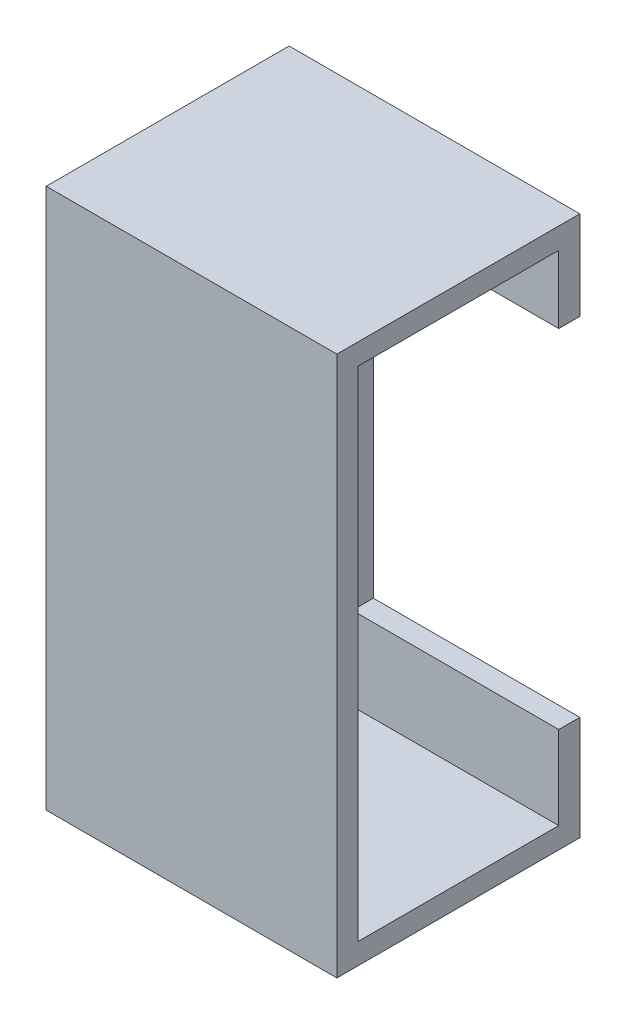
ISO-10303-21;
HEADER;
FILE_DESCRIPTION(('STEP AP214'),'2;1');
FILE_NAME('part.step','',(''),(''),'','','');
FILE_SCHEMA(('AUTOMOTIVE_DESIGN { 1 0 10303 214 1 1 1 1 }'));
ENDSEC;
DATA;
#1=APPLICATION_CONTEXT('core data for automotive mechanical design processes');
#2=APPLICATION_PROTOCOL_DEFINITION('international standard','automotive_design',2000,#1);
#3=PRODUCT_CONTEXT('',#1,'mechanical');
#4=PRODUCT('Part','Part','',(#3));
#5=PRODUCT_RELATED_PRODUCT_CATEGORY('part','',(#4));
#6=PRODUCT_DEFINITION_FORMATION('','',#4);
#7=PRODUCT_DEFINITION_CONTEXT('part definition',#1,'design');
#8=PRODUCT_DEFINITION('design','',#6,#7);
#9=PRODUCT_DEFINITION_SHAPE('','',#8);
#10=(LENGTH_UNIT() NAMED_UNIT(*) SI_UNIT(.MILLI.,.METRE.));
#11=(NAMED_UNIT(*) PLANE_ANGLE_UNIT() SI_UNIT($,.RADIAN.));
#12=(NAMED_UNIT(*) SI_UNIT($,.STERADIAN.) SOLID_ANGLE_UNIT());
#13=UNCERTAINTY_MEASURE_WITH_UNIT(LENGTH_MEASURE(1.E-05),#10,'distance_accuracy_value','');
#14=(GEOMETRIC_REPRESENTATION_CONTEXT(3) GLOBAL_UNCERTAINTY_ASSIGNED_CONTEXT((#13)) GLOBAL_UNIT_ASSIGNED_CONTEXT((#10,
#11,#12)) REPRESENTATION_CONTEXT('',''));
#15=CARTESIAN_POINT('',(0.,0.,0.));
#16=DIRECTION('',(0.,0.,1.));
#17=DIRECTION('',(1.,0.,0.));
#18=AXIS2_PLACEMENT_3D('',#15,#16,#17);
#19=CARTESIAN_POINT('',(-1.09634523681734E-13,94.3783526673284,50.2626326175547));
#20=DIRECTION('',(1.,0.,0.));
#21=DIRECTION('',(0.,0.,1.));
#22=AXIS2_PLACEMENT_3D('',#19,#20,#21);
#23=PLANE('',#22);
#24=DIRECTION('',(0.,1.,0.));
#25=VECTOR('',#24,1.);
#26=CARTESIAN_POINT('',(-1.08524300657109E-13,87.9658533658496,47.3796326175547));
#27=LINE('',#26,#25);
#28=CARTESIAN_POINT('',(-1.08524300657109E-13,87.9658533658496,47.3796326175547));
#29=VERTEX_POINT('',#28);
#30=CARTESIAN_POINT('',(-1.08524300657109E-13,100.790851968807,47.3796326175547));
#31=VERTEX_POINT('',#30);
#32=EDGE_CURVE('E265',#29,#31,#27,.T.);
#33=ORIENTED_EDGE('',*,*,#32,.F.);
#34=DIRECTION('',(0.,0.,-1.));
#35=VECTOR('',#34,1.);
#36=CARTESIAN_POINT('',(-1.14075415780235E-13,87.9658533658496,53.1456326175547));
#37=LINE('',#36,#35);
#38=CARTESIAN_POINT('',(-1.14075415780235E-13,87.9658533658496,53.1456326175547));
#39=VERTEX_POINT('',#38);
#40=EDGE_CURVE('E204',#39,#29,#37,.T.);
#41=ORIENTED_EDGE('',*,*,#40,.F.);
#42=DIRECTION('',(0.,-1.,0.));
#43=VECTOR('',#42,1.);
#44=CARTESIAN_POINT('',(-1.16295861829485E-13,100.790851968807,53.1456326175547));
#45=LINE('',#44,#43);
#46=CARTESIAN_POINT('',(-1.16295861829485E-13,100.790851968807,53.1456326175547));
#47=VERTEX_POINT('',#46);
#48=EDGE_CURVE('E11',#47,#39,#45,.T.);
#49=ORIENTED_EDGE('',*,*,#48,.F.);
#50=DIRECTION('',(0.,0.,1.));
#51=VECTOR('',#50,1.);
#52=CARTESIAN_POINT('',(-1.08524300657109E-13,100.790851968807,47.3796326175547));
#53=LINE('',#52,#51);
#54=EDGE_CURVE('E182',#31,#47,#53,.T.);
#55=ORIENTED_EDGE('',*,*,#54,.F.);
#56=EDGE_LOOP('',(#33,#41,#49,#55));
#57=FACE_BOUND('',#56,.T.);
#58=ADVANCED_FACE('F16',(#57),#23,.F.);
#59=CARTESIAN_POINT('',(6.89999999999989,94.3783526673284,50.2626326175547));
#60=DIRECTION('',(1.,0.,0.));
#61=DIRECTION('',(0.,0.,1.));
#62=AXIS2_PLACEMENT_3D('',#59,#60,#61);
#63=PLANE('',#62);
#64=DIRECTION('',(0.,1.,0.));
#65=VECTOR('',#64,1.);
#66=CARTESIAN_POINT('',(6.89999999999989,87.9658533658496,47.3796326175547));
#67=LINE('',#66,#65);
#68=CARTESIAN_POINT('',(6.89999999999989,98.681771929591,47.3796326175547));
#69=VERTEX_POINT('',#68);
#70=CARTESIAN_POINT('',(6.89999999999989,100.790851968807,47.3796326175547));
#71=VERTEX_POINT('',#70);
#72=EDGE_CURVE('E165',#69,#71,#67,.T.);
#73=ORIENTED_EDGE('',*,*,#72,.T.);
#74=DIRECTION('',(0.,0.,1.));
#75=VECTOR('',#74,1.);
#76=CARTESIAN_POINT('',(6.89999999999989,100.790851968807,47.3796326175547));
#77=LINE('',#76,#75);
#78=CARTESIAN_POINT('',(6.89999999999988,100.790851968807,53.1456326175547));
#79=VERTEX_POINT('',#78);
#80=EDGE_CURVE('E179',#71,#79,#77,.T.);
#81=ORIENTED_EDGE('',*,*,#80,.T.);
#82=DIRECTION('',(0.,-1.,0.));
#83=VECTOR('',#82,1.);
#84=CARTESIAN_POINT('',(6.89999999999988,100.790851968807,53.1456326175547));
#85=LINE('',#84,#83);
#86=CARTESIAN_POINT('',(6.89999999999988,87.9658533658496,53.1456326175547));
#87=VERTEX_POINT('',#86);
#88=EDGE_CURVE('E26',#79,#87,#85,.T.);
#89=ORIENTED_EDGE('',*,*,#88,.T.);
#90=DIRECTION('',(0.,0.,-1.));
#91=VECTOR('',#90,1.);
#92=CARTESIAN_POINT('',(6.89999999999988,87.9658533658496,53.1456326175547));
#93=LINE('',#92,#91);
#94=CARTESIAN_POINT('',(6.89999999999989,87.9658533658496,47.3796326175547));
#95=VERTEX_POINT('',#94);
#96=EDGE_CURVE('E173',#87,#95,#93,.T.);
#97=ORIENTED_EDGE('',*,*,#96,.T.);
#98=DIRECTION('',(0.,1.,0.));
#99=VECTOR('',#98,1.);
#100=CARTESIAN_POINT('',(6.89999999999989,87.9658533658496,47.3796326175547));
#101=LINE('',#100,#99);
#102=CARTESIAN_POINT('',(6.89999999999989,90.4404594516183,47.3796326175547));
#103=VERTEX_POINT('',#102);
#104=EDGE_CURVE('E152',#95,#103,#101,.T.);
#105=ORIENTED_EDGE('',*,*,#104,.T.);
#106=DIRECTION('',(0.,0.,1.));
#107=VECTOR('',#106,1.);
#108=CARTESIAN_POINT('',(6.89999999999989,90.4404594516183,47.8796326175547));
#109=LINE('',#108,#107);
#110=CARTESIAN_POINT('',(6.89999999999989,90.4404594516183,47.8796326175547));
#111=VERTEX_POINT('',#110);
#112=EDGE_CURVE('E147',#103,#111,#109,.T.);
#113=ORIENTED_EDGE('',*,*,#112,.T.);
#114=DIRECTION('',(0.,-1.,0.));
#115=VECTOR('',#114,1.);
#116=CARTESIAN_POINT('',(6.89999999999989,88.4658533658496,47.8796326175547));
#117=LINE('',#116,#115);
#118=CARTESIAN_POINT('',(6.89999999999989,88.4658533658496,47.8796326175547));
#119=VERTEX_POINT('',#118);
#120=EDGE_CURVE('E224',#111,#119,#117,.T.);
#121=ORIENTED_EDGE('',*,*,#120,.T.);
#122=DIRECTION('',(0.,0.,1.));
#123=VECTOR('',#122,1.);
#124=CARTESIAN_POINT('',(6.89999999999989,88.4658533658496,52.6456326175547));
#125=LINE('',#124,#123);
#126=CARTESIAN_POINT('',(6.89999999999989,88.4658533658496,52.6456326175547));
#127=VERTEX_POINT('',#126);
#128=EDGE_CURVE('E174',#119,#127,#125,.T.);
#129=ORIENTED_EDGE('',*,*,#128,.T.);
#130=DIRECTION('',(0.,1.,0.));
#131=VECTOR('',#130,1.);
#132=CARTESIAN_POINT('',(6.89999999999989,100.290851968807,52.6456326175547));
#133=LINE('',#132,#131);
#134=CARTESIAN_POINT('',(6.89999999999989,100.290851968807,52.6456326175547));
#135=VERTEX_POINT('',#134);
#136=EDGE_CURVE('E216',#127,#135,#133,.T.);
#137=ORIENTED_EDGE('',*,*,#136,.T.);
#138=DIRECTION('',(0.,0.,-1.));
#139=VECTOR('',#138,1.);
#140=CARTESIAN_POINT('',(6.89999999999989,100.290851968807,47.8796326175547));
#141=LINE('',#140,#139);
#142=CARTESIAN_POINT('',(6.89999999999989,100.290851968807,47.8796326175547));
#143=VERTEX_POINT('',#142);
#144=EDGE_CURVE('E142',#135,#143,#141,.T.);
#145=ORIENTED_EDGE('',*,*,#144,.T.);
#146=DIRECTION('',(0.,-1.,0.));
#147=VECTOR('',#146,1.);
#148=CARTESIAN_POINT('',(6.89999999999989,88.4658533658496,47.8796326175547));
#149=LINE('',#148,#147);
#150=CARTESIAN_POINT('',(6.89999999999989,98.681771929591,47.8796326175547));
#151=VERTEX_POINT('',#150);
#152=EDGE_CURVE('E208',#143,#151,#149,.T.);
#153=ORIENTED_EDGE('',*,*,#152,.T.);
#154=DIRECTION('',(0.,0.,-1.));
#155=VECTOR('',#154,1.);
#156=CARTESIAN_POINT('',(6.89999999999989,98.681771929591,47.3796326175547));
#157=LINE('',#156,#155);
#158=EDGE_CURVE('E185',#151,#69,#157,.T.);
#159=ORIENTED_EDGE('',*,*,#158,.T.);
#160=EDGE_LOOP('',(#73,#81,#89,#97,#105,#113,#121,#129,#137,#145,#153,#159));
#161=FACE_BOUND('',#160,.T.);
#162=ADVANCED_FACE('F282',(#161),#63,.T.);
#163=CARTESIAN_POINT('',(-1.16295861829485E-13,100.790851968807,53.1456326175547));
#164=DIRECTION('',(0.,0.,1.));
#165=DIRECTION('',(1.,0.,0.));
#166=AXIS2_PLACEMENT_3D('',#163,#164,#165);
#167=PLANE('',#166);
#168=DIRECTION('',(1.,0.,0.));
#169=VECTOR('',#168,1.);
#170=CARTESIAN_POINT('',(-1.14075415780235E-13,87.9658533658496,53.1456326175547));
#171=LINE('',#170,#169);
#172=EDGE_CURVE('E207',#39,#87,#171,.T.);
#173=ORIENTED_EDGE('',*,*,#172,.T.);
#174=ORIENTED_EDGE('',*,*,#88,.F.);
#175=DIRECTION('',(1.,0.,0.));
#176=VECTOR('',#175,1.);
#177=CARTESIAN_POINT('',(-1.16295861829485E-13,100.790851968807,53.1456326175547));
#178=LINE('',#177,#176);
#179=EDGE_CURVE('E183',#47,#79,#178,.T.);
#180=ORIENTED_EDGE('',*,*,#179,.F.);
#181=ORIENTED_EDGE('',*,*,#48,.T.);
#182=EDGE_LOOP('',(#173,#174,#180,#181));
#183=FACE_BOUND('',#182,.T.);
#184=ADVANCED_FACE('F303',(#183),#167,.T.);
#185=CARTESIAN_POINT('',(-1.14075415780235E-13,87.9658533658496,53.1456326175547));
#186=DIRECTION('',(0.,-1.,0.));
#187=DIRECTION('',(-1.,0.,0.));
#188=AXIS2_PLACEMENT_3D('',#185,#186,#187);
#189=PLANE('',#188);
#190=DIRECTION('',(1.,0.,0.));
#191=VECTOR('',#190,1.);
#192=CARTESIAN_POINT('',(-1.08524300657109E-13,87.9658533658496,47.3796326175547));
#193=LINE('',#192,#191);
#194=EDGE_CURVE('E243',#29,#95,#193,.T.);
#195=ORIENTED_EDGE('',*,*,#194,.T.);
#196=ORIENTED_EDGE('',*,*,#96,.F.);
#197=ORIENTED_EDGE('',*,*,#172,.F.);
#198=ORIENTED_EDGE('',*,*,#40,.T.);
#199=EDGE_LOOP('',(#195,#196,#197,#198));
#200=FACE_BOUND('',#199,.T.);
#201=ADVANCED_FACE('F316',(#200),#189,.T.);
#202=CARTESIAN_POINT('',(-1.08524300657109E-13,90.4404594516183,47.3796326175547));
#203=DIRECTION('',(0.,1.,0.));
#204=DIRECTION('',(1.,0.,0.));
#205=AXIS2_PLACEMENT_3D('',#202,#203,#204);
#206=PLANE('',#205);
#207=DIRECTION('',(0.,0.,1.));
#208=VECTOR('',#207,1.);
#209=CARTESIAN_POINT('',(1.99999999999989,90.4404594516183,47.5046326175547));
#210=LINE('',#209,#208);
#211=CARTESIAN_POINT('',(1.99999999999989,90.4404594516183,47.3796326175547));
#212=VERTEX_POINT('',#211);
#213=CARTESIAN_POINT('',(1.99999999999989,90.4404594516183,47.8796326175547));
#214=VERTEX_POINT('',#213);
#215=EDGE_CURVE('E129',#212,#214,#210,.T.);
#216=ORIENTED_EDGE('',*,*,#215,.T.);
#217=DIRECTION('',(1.,0.,0.));
#218=VECTOR('',#217,1.);
#219=CARTESIAN_POINT('',(-1.08524300657109E-13,90.4404594516183,47.8796326175547));
#220=LINE('',#219,#218);
#221=EDGE_CURVE('E211',#214,#111,#220,.T.);
#222=ORIENTED_EDGE('',*,*,#221,.T.);
#223=ORIENTED_EDGE('',*,*,#112,.F.);
#224=DIRECTION('',(1.,0.,0.));
#225=VECTOR('',#224,1.);
#226=CARTESIAN_POINT('',(-1.08524300657109E-13,90.4404594516183,47.3796326175547));
#227=LINE('',#226,#225);
#228=EDGE_CURVE('E145',#212,#103,#227,.T.);
#229=ORIENTED_EDGE('',*,*,#228,.F.);
#230=EDGE_LOOP('',(#216,#222,#223,#229));
#231=FACE_BOUND('',#230,.T.);
#232=ADVANCED_FACE('F146',(#231),#206,.T.);
#233=CARTESIAN_POINT('',(-1.08524300657109E-13,88.4658533658496,47.8796326175547));
#234=DIRECTION('',(0.,1.,0.));
#235=DIRECTION('',(1.,0.,0.));
#236=AXIS2_PLACEMENT_3D('',#233,#234,#235);
#237=PLANE('',#236);
#238=DIRECTION('',(0.,0.,1.));
#239=VECTOR('',#238,1.);
#240=CARTESIAN_POINT('',(0.899999999999892,88.4658533658496,49.0711326175547));
#241=LINE('',#240,#239);
#242=CARTESIAN_POINT('',(0.899999999999894,88.4658533658496,47.8796326175547));
#243=VERTEX_POINT('',#242);
#244=CARTESIAN_POINT('',(0.89999999999989,88.4658533658496,52.6456326175547));
#245=VERTEX_POINT('',#244);
#246=EDGE_CURVE('E233',#243,#245,#241,.T.);
#247=ORIENTED_EDGE('',*,*,#246,.T.);
#248=DIRECTION('',(1.,0.,0.));
#249=VECTOR('',#248,1.);
#250=CARTESIAN_POINT('',(-1.1296519275561E-13,88.4658533658496,52.6456326175547));
#251=LINE('',#250,#249);
#252=EDGE_CURVE('E202',#245,#127,#251,.T.);
#253=ORIENTED_EDGE('',*,*,#252,.T.);
#254=ORIENTED_EDGE('',*,*,#128,.F.);
#255=DIRECTION('',(1.,0.,0.));
#256=VECTOR('',#255,1.);
#257=CARTESIAN_POINT('',(-1.08524300657109E-13,88.4658533658496,47.8796326175547));
#258=LINE('',#257,#256);
#259=EDGE_CURVE('E223',#243,#119,#258,.T.);
#260=ORIENTED_EDGE('',*,*,#259,.F.);
#261=EDGE_LOOP('',(#247,#253,#254,#260));
#262=FACE_BOUND('',#261,.T.);
#263=ADVANCED_FACE('F295',(#262),#237,.T.);
#264=CARTESIAN_POINT('',(-1.08524300657109E-13,100.290851968807,47.8796326175547));
#265=DIRECTION('',(0.,0.,1.));
#266=DIRECTION('',(1.,0.,0.));
#267=AXIS2_PLACEMENT_3D('',#264,#265,#266);
#268=PLANE('',#267);
#269=DIRECTION('',(0.,-1.,0.));
#270=VECTOR('',#269,1.);
#271=CARTESIAN_POINT('',(0.899999999999892,97.3346023180678,47.8796326175547));
#272=LINE('',#271,#270);
#273=CARTESIAN_POINT('',(0.899999999999892,100.290851968807,47.8796326175547));
#274=VERTEX_POINT('',#273);
#275=EDGE_CURVE('E248',#274,#243,#272,.T.);
#276=ORIENTED_EDGE('',*,*,#275,.T.);
#277=ORIENTED_EDGE('',*,*,#259,.T.);
#278=ORIENTED_EDGE('',*,*,#120,.F.);
#279=ORIENTED_EDGE('',*,*,#221,.F.);
#280=DIRECTION('',(0.,1.,0.));
#281=VECTOR('',#280,1.);
#282=CARTESIAN_POINT('',(1.99999999999989,96.6214438100978,47.8796326175547));
#283=LINE('',#282,#281);
#284=CARTESIAN_POINT('',(1.99999999999989,98.681771929591,47.8796326175547));
#285=VERTEX_POINT('',#284);
#286=EDGE_CURVE('E137',#214,#285,#283,.T.);
#287=ORIENTED_EDGE('',*,*,#286,.T.);
#288=DIRECTION('',(1.,0.,0.));
#289=VECTOR('',#288,1.);
#290=CARTESIAN_POINT('',(-1.08524300657109E-13,98.681771929591,47.8796326175547));
#291=LINE('',#290,#289);
#292=EDGE_CURVE('E192',#285,#151,#291,.T.);
#293=ORIENTED_EDGE('',*,*,#292,.T.);
#294=ORIENTED_EDGE('',*,*,#152,.F.);
#295=DIRECTION('',(1.,0.,0.));
#296=VECTOR('',#295,1.);
#297=CARTESIAN_POINT('',(-1.08524300657109E-13,100.290851968807,47.8796326175547));
#298=LINE('',#297,#296);
#299=EDGE_CURVE('E178',#274,#143,#298,.T.);
#300=ORIENTED_EDGE('',*,*,#299,.F.);
#301=EDGE_LOOP('',(#276,#277,#278,#279,#287,#293,#294,#300));
#302=FACE_BOUND('',#301,.T.);
#303=ADVANCED_FACE('F286',(#302),#268,.T.);
#304=CARTESIAN_POINT('',(-1.08524300657109E-13,98.681771929591,47.8796326175547));
#305=DIRECTION('',(0.,-1.,0.));
#306=DIRECTION('',(-1.,0.,0.));
#307=AXIS2_PLACEMENT_3D('',#304,#305,#306);
#308=PLANE('',#307);
#309=DIRECTION('',(0.,0.,-1.));
#310=VECTOR('',#309,1.);
#311=CARTESIAN_POINT('',(1.99999999999989,98.681771929591,47.7546326175547));
#312=LINE('',#311,#310);
#313=CARTESIAN_POINT('',(1.99999999999989,98.681771929591,47.3796326175547));
#314=VERTEX_POINT('',#313);
#315=EDGE_CURVE('E141',#285,#314,#312,.T.);
#316=ORIENTED_EDGE('',*,*,#315,.T.);
#317=DIRECTION('',(1.,0.,0.));
#318=VECTOR('',#317,1.);
#319=CARTESIAN_POINT('',(-1.08524300657109E-13,98.681771929591,47.3796326175547));
#320=LINE('',#319,#318);
#321=EDGE_CURVE('E158',#314,#69,#320,.T.);
#322=ORIENTED_EDGE('',*,*,#321,.T.);
#323=ORIENTED_EDGE('',*,*,#158,.F.);
#324=ORIENTED_EDGE('',*,*,#292,.F.);
#325=EDGE_LOOP('',(#316,#322,#323,#324));
#326=FACE_BOUND('',#325,.T.);
#327=ADVANCED_FACE('F284',(#326),#308,.T.);
#328=CARTESIAN_POINT('',(1.99999999999989,94.5611156906047,47.6296326175547));
#329=DIRECTION('',(-1.,0.,0.));
#330=DIRECTION('',(0.,0.,1.));
#331=AXIS2_PLACEMENT_3D('',#328,#329,#330);
#332=PLANE('',#331);
#333=ORIENTED_EDGE('',*,*,#215,.F.);
#334=DIRECTION('',(0.,-1.,0.));
#335=VECTOR('',#334,1.);
#336=CARTESIAN_POINT('',(1.99999999999989,92.5007875711115,47.3796326175547));
#337=LINE('',#336,#335);
#338=EDGE_CURVE('E134',#314,#212,#337,.T.);
#339=ORIENTED_EDGE('',*,*,#338,.F.);
#340=ORIENTED_EDGE('',*,*,#315,.F.);
#341=ORIENTED_EDGE('',*,*,#286,.F.);
#342=EDGE_LOOP('',(#333,#339,#340,#341));
#343=FACE_BOUND('',#342,.T.);
#344=ADVANCED_FACE('F131',(#343),#332,.F.);
#345=CARTESIAN_POINT('',(-1.1518563880486E-13,100.290851968807,52.6456326175547));
#346=DIRECTION('',(0.,-1.,0.));
#347=DIRECTION('',(-1.,0.,0.));
#348=AXIS2_PLACEMENT_3D('',#345,#346,#347);
#349=PLANE('',#348);
#350=DIRECTION('',(0.,0.,-1.));
#351=VECTOR('',#350,1.);
#352=CARTESIAN_POINT('',(0.899999999999887,100.290851968807,51.4541326175547));
#353=LINE('',#352,#351);
#354=CARTESIAN_POINT('',(0.899999999999886,100.290851968807,52.6456326175547));
#355=VERTEX_POINT('',#354);
#356=EDGE_CURVE('E244',#355,#274,#353,.T.);
#357=ORIENTED_EDGE('',*,*,#356,.T.);
#358=ORIENTED_EDGE('',*,*,#299,.T.);
#359=ORIENTED_EDGE('',*,*,#144,.F.);
#360=DIRECTION('',(1.,0.,0.));
#361=VECTOR('',#360,1.);
#362=CARTESIAN_POINT('',(-1.1518563880486E-13,100.290851968807,52.6456326175547));
#363=LINE('',#362,#361);
#364=EDGE_CURVE('E219',#355,#135,#363,.T.);
#365=ORIENTED_EDGE('',*,*,#364,.F.);
#366=EDGE_LOOP('',(#357,#358,#359,#365));
#367=FACE_BOUND('',#366,.T.);
#368=ADVANCED_FACE('F293',(#367),#349,.T.);
#369=CARTESIAN_POINT('',(-1.1296519275561E-13,88.4658533658496,52.6456326175547));
#370=DIRECTION('',(0.,0.,-1.));
#371=DIRECTION('',(0.,-1.,0.));
#372=AXIS2_PLACEMENT_3D('',#369,#370,#371);
#373=PLANE('',#372);
#374=DIRECTION('',(0.,1.,0.));
#375=VECTOR('',#374,1.);
#376=CARTESIAN_POINT('',(0.899999999999888,91.422103016589,52.6456326175547));
#377=LINE('',#376,#375);
#378=EDGE_CURVE('E169',#245,#355,#377,.T.);
#379=ORIENTED_EDGE('',*,*,#378,.T.);
#380=ORIENTED_EDGE('',*,*,#364,.T.);
#381=ORIENTED_EDGE('',*,*,#136,.F.);
#382=ORIENTED_EDGE('',*,*,#252,.F.);
#383=EDGE_LOOP('',(#379,#380,#381,#382));
#384=FACE_BOUND('',#383,.T.);
#385=ADVANCED_FACE('F307',(#384),#373,.T.);
#386=CARTESIAN_POINT('',(-1.08524300657109E-13,100.790851968807,47.3796326175547));
#387=DIRECTION('',(0.,1.,0.));
#388=DIRECTION('',(1.,0.,0.));
#389=AXIS2_PLACEMENT_3D('',#386,#387,#388);
#390=PLANE('',#389);
#391=ORIENTED_EDGE('',*,*,#179,.T.);
#392=ORIENTED_EDGE('',*,*,#80,.F.);
#393=DIRECTION('',(1.,0.,0.));
#394=VECTOR('',#393,1.);
#395=CARTESIAN_POINT('',(-1.08524300657109E-13,100.790851968807,47.3796326175547));
#396=LINE('',#395,#394);
#397=EDGE_CURVE('E237',#31,#71,#396,.T.);
#398=ORIENTED_EDGE('',*,*,#397,.F.);
#399=ORIENTED_EDGE('',*,*,#54,.T.);
#400=EDGE_LOOP('',(#391,#392,#398,#399));
#401=FACE_BOUND('',#400,.T.);
#402=ADVANCED_FACE('F280',(#401),#390,.T.);
#403=CARTESIAN_POINT('',(-1.08524300657109E-13,98.681771929591,47.3796326175547));
#404=DIRECTION('',(0.,0.,-1.));
#405=DIRECTION('',(0.,-1.,0.));
#406=AXIS2_PLACEMENT_3D('',#403,#404,#405);
#407=PLANE('',#406);
#408=ORIENTED_EDGE('',*,*,#397,.T.);
#409=ORIENTED_EDGE('',*,*,#72,.F.);
#410=ORIENTED_EDGE('',*,*,#321,.F.);
#411=ORIENTED_EDGE('',*,*,#338,.T.);
#412=ORIENTED_EDGE('',*,*,#228,.T.);
#413=ORIENTED_EDGE('',*,*,#104,.F.);
#414=ORIENTED_EDGE('',*,*,#194,.F.);
#415=ORIENTED_EDGE('',*,*,#32,.T.);
#416=EDGE_LOOP('',(#408,#409,#410,#411,#412,#413,#414,#415));
#417=FACE_BOUND('',#416,.T.);
#418=ADVANCED_FACE('F155',(#417),#407,.T.);
#419=CARTESIAN_POINT('',(0.899999999999891,94.3783526673284,50.2626326175547));
#420=DIRECTION('',(1.,0.,0.));
#421=DIRECTION('',(0.,0.,1.));
#422=AXIS2_PLACEMENT_3D('',#419,#420,#421);
#423=PLANE('',#422);
#424=ORIENTED_EDGE('',*,*,#275,.F.);
#425=ORIENTED_EDGE('',*,*,#356,.F.);
#426=ORIENTED_EDGE('',*,*,#378,.F.);
#427=ORIENTED_EDGE('',*,*,#246,.F.);
#428=EDGE_LOOP('',(#424,#425,#426,#427));
#429=FACE_BOUND('',#428,.T.);
#430=ADVANCED_FACE('F18',(#429),#423,.T.);
#431=CLOSED_SHELL('',(#58,#162,#184,#201,#232,#263,#303,#327,#344,#368,#385,#402,#418,#430));
#432=MANIFOLD_SOLID_BREP('B1',#431);
#433=ADVANCED_BREP_SHAPE_REPRESENTATION('',(#18,#432),#14);
#434=SHAPE_DEFINITION_REPRESENTATION(#9,#433);
ENDSEC;
END-ISO-10303-21;
